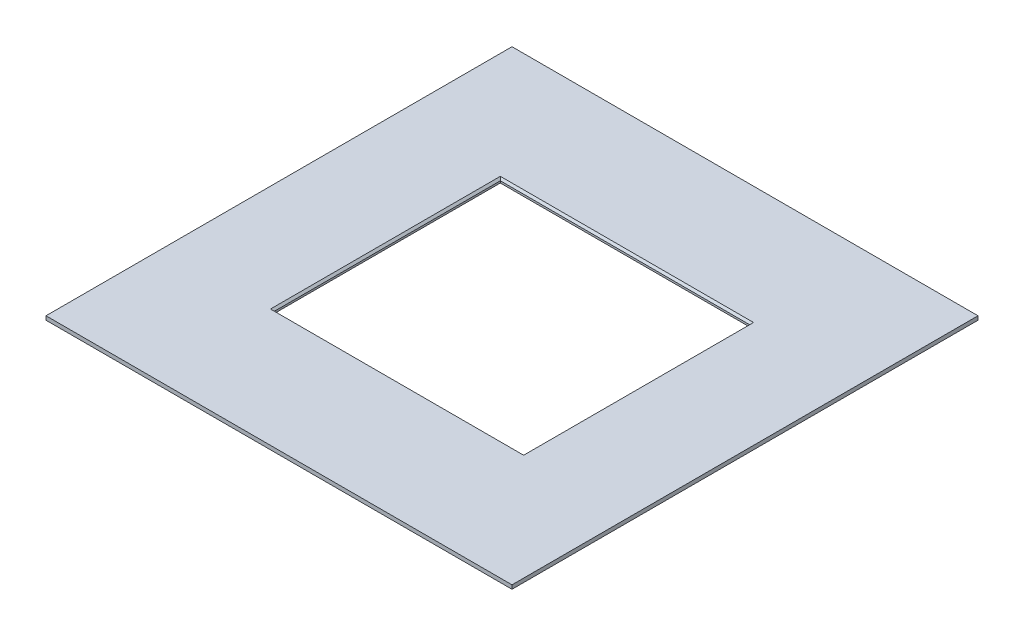
ISO-10303-21;
HEADER;
FILE_DESCRIPTION(('STEP AP214'),'2;1');
FILE_NAME('part.step','',(''),(''),'','','');
FILE_SCHEMA(('AUTOMOTIVE_DESIGN { 1 0 10303 214 1 1 1 1 }'));
ENDSEC;
DATA;
#1=APPLICATION_CONTEXT('core data for automotive mechanical design processes');
#2=APPLICATION_PROTOCOL_DEFINITION('international standard','automotive_design',2000,#1);
#3=PRODUCT_CONTEXT('',#1,'mechanical');
#4=PRODUCT('Part','Part','',(#3));
#5=PRODUCT_RELATED_PRODUCT_CATEGORY('part','',(#4));
#6=PRODUCT_DEFINITION_FORMATION('','',#4);
#7=PRODUCT_DEFINITION_CONTEXT('part definition',#1,'design');
#8=PRODUCT_DEFINITION('design','',#6,#7);
#9=PRODUCT_DEFINITION_SHAPE('','',#8);
#10=(LENGTH_UNIT() NAMED_UNIT(*) SI_UNIT(.MILLI.,.METRE.));
#11=(NAMED_UNIT(*) PLANE_ANGLE_UNIT() SI_UNIT($,.RADIAN.));
#12=(NAMED_UNIT(*) SI_UNIT($,.STERADIAN.) SOLID_ANGLE_UNIT());
#13=UNCERTAINTY_MEASURE_WITH_UNIT(LENGTH_MEASURE(1.E-05),#10,'distance_accuracy_value','');
#14=(GEOMETRIC_REPRESENTATION_CONTEXT(3) GLOBAL_UNCERTAINTY_ASSIGNED_CONTEXT((#13)) GLOBAL_UNIT_ASSIGNED_CONTEXT((#10,
#11,#12)) REPRESENTATION_CONTEXT('',''));
#15=CARTESIAN_POINT('',(0.,0.,0.));
#16=DIRECTION('',(0.,0.,1.));
#17=DIRECTION('',(1.,0.,0.));
#18=AXIS2_PLACEMENT_3D('',#15,#16,#17);
#19=CARTESIAN_POINT('',(0.,1.,0.));
#20=DIRECTION('',(0.,1.,0.));
#21=DIRECTION('',(0.,0.,1.));
#22=AXIS2_PLACEMENT_3D('',#19,#20,#21);
#23=PLANE('',#22);
#24=DIRECTION('',(0.,0.,1.));
#25=VECTOR('',#24,1.);
#26=CARTESIAN_POINT('',(32.6,1.,0.));
#27=LINE('',#26,#25);
#28=CARTESIAN_POINT('',(32.6,1.,-29.6));
#29=VERTEX_POINT('',#28);
#30=CARTESIAN_POINT('',(32.6,1.,29.6));
#31=VERTEX_POINT('',#30);
#32=EDGE_CURVE('E210',#29,#31,#27,.T.);
#33=ORIENTED_EDGE('',*,*,#32,.T.);
#34=DIRECTION('',(-1.,0.,0.));
#35=VECTOR('',#34,1.);
#36=CARTESIAN_POINT('',(0.,1.,29.6));
#37=LINE('',#36,#35);
#38=CARTESIAN_POINT('',(-32.6,1.,29.6));
#39=VERTEX_POINT('',#38);
#40=EDGE_CURVE('E213',#31,#39,#37,.T.);
#41=ORIENTED_EDGE('',*,*,#40,.T.);
#42=DIRECTION('',(0.,0.,-1.));
#43=VECTOR('',#42,1.);
#44=CARTESIAN_POINT('',(-32.6,1.,0.));
#45=LINE('',#44,#43);
#46=CARTESIAN_POINT('',(-32.6,1.,-29.6));
#47=VERTEX_POINT('',#46);
#48=EDGE_CURVE('E207',#39,#47,#45,.T.);
#49=ORIENTED_EDGE('',*,*,#48,.T.);
#50=DIRECTION('',(1.,0.,0.));
#51=VECTOR('',#50,1.);
#52=CARTESIAN_POINT('',(0.,1.,-29.6));
#53=LINE('',#52,#51);
#54=EDGE_CURVE('E204',#47,#29,#53,.T.);
#55=ORIENTED_EDGE('',*,*,#54,.T.);
#56=EDGE_LOOP('',(#33,#41,#49,#55));
#57=FACE_BOUND('',#56,.T.);
#58=DIRECTION('',(0.,0.,-1.));
#59=VECTOR('',#58,1.);
#60=CARTESIAN_POINT('',(60.,1.,-60.));
#61=LINE('',#60,#59);
#62=CARTESIAN_POINT('',(60.,1.,60.));
#63=VERTEX_POINT('',#62);
#64=CARTESIAN_POINT('',(60.,1.,-60.));
#65=VERTEX_POINT('',#64);
#66=EDGE_CURVE('E159',#63,#65,#61,.T.);
#67=ORIENTED_EDGE('',*,*,#66,.T.);
#68=DIRECTION('',(-1.,0.,0.));
#69=VECTOR('',#68,1.);
#70=CARTESIAN_POINT('',(-60.,1.,-60.));
#71=LINE('',#70,#69);
#72=CARTESIAN_POINT('',(-60.,1.,-60.));
#73=VERTEX_POINT('',#72);
#74=EDGE_CURVE('E163',#65,#73,#71,.T.);
#75=ORIENTED_EDGE('',*,*,#74,.T.);
#76=DIRECTION('',(0.,0.,1.));
#77=VECTOR('',#76,1.);
#78=CARTESIAN_POINT('',(-60.,1.,-60.));
#79=LINE('',#78,#77);
#80=CARTESIAN_POINT('',(-60.,1.,60.));
#81=VERTEX_POINT('',#80);
#82=EDGE_CURVE('E167',#73,#81,#79,.T.);
#83=ORIENTED_EDGE('',*,*,#82,.T.);
#84=DIRECTION('',(1.,0.,0.));
#85=VECTOR('',#84,1.);
#86=CARTESIAN_POINT('',(-60.,1.,60.));
#87=LINE('',#86,#85);
#88=EDGE_CURVE('E170',#81,#63,#87,.T.);
#89=ORIENTED_EDGE('',*,*,#88,.T.);
#90=EDGE_LOOP('',(#67,#75,#83,#89));
#91=FACE_BOUND('',#90,.T.);
#92=ADVANCED_FACE('F41',(#57,#91),#23,.T.);
#93=CARTESIAN_POINT('',(0.,0.,0.));
#94=DIRECTION('',(0.,1.,0.));
#95=DIRECTION('',(0.,0.,1.));
#96=AXIS2_PLACEMENT_3D('',#93,#94,#95);
#97=PLANE('',#96);
#98=DIRECTION('',(0.,0.,-1.));
#99=VECTOR('',#98,1.);
#100=CARTESIAN_POINT('',(60.,0.,-60.));
#101=LINE('',#100,#99);
#102=CARTESIAN_POINT('',(60.,0.,60.));
#103=VERTEX_POINT('',#102);
#104=CARTESIAN_POINT('',(60.,0.,-60.));
#105=VERTEX_POINT('',#104);
#106=EDGE_CURVE('E126',#103,#105,#101,.T.);
#107=ORIENTED_EDGE('',*,*,#106,.F.);
#108=DIRECTION('',(1.,0.,0.));
#109=VECTOR('',#108,1.);
#110=CARTESIAN_POINT('',(-60.,0.,60.));
#111=LINE('',#110,#109);
#112=CARTESIAN_POINT('',(-60.,0.,60.));
#113=VERTEX_POINT('',#112);
#114=EDGE_CURVE('E164',#113,#103,#111,.T.);
#115=ORIENTED_EDGE('',*,*,#114,.F.);
#116=DIRECTION('',(0.,0.,1.));
#117=VECTOR('',#116,1.);
#118=CARTESIAN_POINT('',(-60.,0.,-60.));
#119=LINE('',#118,#117);
#120=CARTESIAN_POINT('',(-60.,0.,-60.));
#121=VERTEX_POINT('',#120);
#122=EDGE_CURVE('E180',#121,#113,#119,.T.);
#123=ORIENTED_EDGE('',*,*,#122,.F.);
#124=DIRECTION('',(-1.,0.,0.));
#125=VECTOR('',#124,1.);
#126=CARTESIAN_POINT('',(-60.,0.,-60.));
#127=LINE('',#126,#125);
#128=EDGE_CURVE('E177',#105,#121,#127,.T.);
#129=ORIENTED_EDGE('',*,*,#128,.F.);
#130=EDGE_LOOP('',(#107,#115,#123,#129));
#131=FACE_BOUND('',#130,.T.);
#132=DIRECTION('',(0.,0.,-1.));
#133=VECTOR('',#132,1.);
#134=CARTESIAN_POINT('',(32.1,0.,-29.1));
#135=LINE('',#134,#133);
#136=CARTESIAN_POINT('',(32.1,0.,29.1));
#137=VERTEX_POINT('',#136);
#138=CARTESIAN_POINT('',(32.1,0.,-29.1));
#139=VERTEX_POINT('',#138);
#140=EDGE_CURVE('E123',#137,#139,#135,.T.);
#141=ORIENTED_EDGE('',*,*,#140,.T.);
#142=DIRECTION('',(-1.,0.,0.));
#143=VECTOR('',#142,1.);
#144=CARTESIAN_POINT('',(-32.1,0.,-29.1));
#145=LINE('',#144,#143);
#146=CARTESIAN_POINT('',(-32.1,0.,-29.1));
#147=VERTEX_POINT('',#146);
#148=EDGE_CURVE('E130',#139,#147,#145,.T.);
#149=ORIENTED_EDGE('',*,*,#148,.T.);
#150=DIRECTION('',(0.,0.,1.));
#151=VECTOR('',#150,1.);
#152=CARTESIAN_POINT('',(-32.1,0.,-29.1));
#153=LINE('',#152,#151);
#154=CARTESIAN_POINT('',(-32.1,0.,29.1));
#155=VERTEX_POINT('',#154);
#156=EDGE_CURVE('E136',#147,#155,#153,.T.);
#157=ORIENTED_EDGE('',*,*,#156,.T.);
#158=DIRECTION('',(1.,0.,0.));
#159=VECTOR('',#158,1.);
#160=CARTESIAN_POINT('',(-32.1,0.,29.1));
#161=LINE('',#160,#159);
#162=EDGE_CURVE('E140',#155,#137,#161,.T.);
#163=ORIENTED_EDGE('',*,*,#162,.T.);
#164=EDGE_LOOP('',(#141,#149,#157,#163));
#165=FACE_BOUND('',#164,.T.);
#166=ADVANCED_FACE('F138',(#131,#165),#97,.F.);
#167=CARTESIAN_POINT('',(60.,1.,-60.));
#168=DIRECTION('',(-1.,0.,0.));
#169=DIRECTION('',(0.,0.,1.));
#170=AXIS2_PLACEMENT_3D('',#167,#168,#169);
#171=PLANE('',#170);
#172=ORIENTED_EDGE('',*,*,#106,.T.);
#173=DIRECTION('',(0.,-1.,0.));
#174=VECTOR('',#173,1.);
#175=CARTESIAN_POINT('',(60.,1.,-60.));
#176=LINE('',#175,#174);
#177=EDGE_CURVE('E196',#65,#105,#176,.T.);
#178=ORIENTED_EDGE('',*,*,#177,.F.);
#179=ORIENTED_EDGE('',*,*,#66,.F.);
#180=DIRECTION('',(0.,-1.,0.));
#181=VECTOR('',#180,1.);
#182=CARTESIAN_POINT('',(60.,1.,60.));
#183=LINE('',#182,#181);
#184=EDGE_CURVE('E173',#63,#103,#183,.T.);
#185=ORIENTED_EDGE('',*,*,#184,.T.);
#186=EDGE_LOOP('',(#172,#178,#179,#185));
#187=FACE_BOUND('',#186,.T.);
#188=ADVANCED_FACE('F260',(#187),#171,.F.);
#189=CARTESIAN_POINT('',(-60.,1.,-60.));
#190=DIRECTION('',(0.,0.,1.));
#191=DIRECTION('',(1.,0.,0.));
#192=AXIS2_PLACEMENT_3D('',#189,#190,#191);
#193=PLANE('',#192);
#194=ORIENTED_EDGE('',*,*,#128,.T.);
#195=DIRECTION('',(0.,-1.,0.));
#196=VECTOR('',#195,1.);
#197=CARTESIAN_POINT('',(-60.,1.,-60.));
#198=LINE('',#197,#196);
#199=EDGE_CURVE('E192',#73,#121,#198,.T.);
#200=ORIENTED_EDGE('',*,*,#199,.F.);
#201=ORIENTED_EDGE('',*,*,#74,.F.);
#202=ORIENTED_EDGE('',*,*,#177,.T.);
#203=EDGE_LOOP('',(#194,#200,#201,#202));
#204=FACE_BOUND('',#203,.T.);
#205=ADVANCED_FACE('F263',(#204),#193,.F.);
#206=CARTESIAN_POINT('',(-60.,1.,-60.));
#207=DIRECTION('',(1.,0.,0.));
#208=DIRECTION('',(0.,0.,-1.));
#209=AXIS2_PLACEMENT_3D('',#206,#207,#208);
#210=PLANE('',#209);
#211=ORIENTED_EDGE('',*,*,#122,.T.);
#212=DIRECTION('',(0.,-1.,0.));
#213=VECTOR('',#212,1.);
#214=CARTESIAN_POINT('',(-60.,1.,60.));
#215=LINE('',#214,#213);
#216=EDGE_CURVE('E188',#81,#113,#215,.T.);
#217=ORIENTED_EDGE('',*,*,#216,.F.);
#218=ORIENTED_EDGE('',*,*,#82,.F.);
#219=ORIENTED_EDGE('',*,*,#199,.T.);
#220=EDGE_LOOP('',(#211,#217,#218,#219));
#221=FACE_BOUND('',#220,.T.);
#222=ADVANCED_FACE('F268',(#221),#210,.F.);
#223=CARTESIAN_POINT('',(-60.,1.,60.));
#224=DIRECTION('',(0.,0.,-1.));
#225=DIRECTION('',(-1.,0.,0.));
#226=AXIS2_PLACEMENT_3D('',#223,#224,#225);
#227=PLANE('',#226);
#228=ORIENTED_EDGE('',*,*,#114,.T.);
#229=ORIENTED_EDGE('',*,*,#184,.F.);
#230=ORIENTED_EDGE('',*,*,#88,.F.);
#231=ORIENTED_EDGE('',*,*,#216,.T.);
#232=EDGE_LOOP('',(#228,#229,#230,#231));
#233=FACE_BOUND('',#232,.T.);
#234=ADVANCED_FACE('F271',(#233),#227,.F.);
#235=CARTESIAN_POINT('',(32.1,1.,-29.1));
#236=DIRECTION('',(-1.,0.,0.));
#237=DIRECTION('',(0.,0.,1.));
#238=AXIS2_PLACEMENT_3D('',#235,#236,#237);
#239=PLANE('',#238);
#240=DIRECTION('',(0.,-1.,0.));
#241=VECTOR('',#240,1.);
#242=CARTESIAN_POINT('',(32.1,1.,29.1));
#243=LINE('',#242,#241);
#244=CARTESIAN_POINT('',(32.1,0.5,29.1));
#245=VERTEX_POINT('',#244);
#246=EDGE_CURVE('E151',#245,#137,#243,.T.);
#247=ORIENTED_EDGE('',*,*,#246,.F.);
#248=DIRECTION('',(0.,0.,-1.));
#249=VECTOR('',#248,1.);
#250=CARTESIAN_POINT('',(32.1,0.5,-29.1));
#251=LINE('',#250,#249);
#252=CARTESIAN_POINT('',(32.1,0.5,-29.1));
#253=VERTEX_POINT('',#252);
#254=EDGE_CURVE('E66',#245,#253,#251,.T.);
#255=ORIENTED_EDGE('',*,*,#254,.T.);
#256=DIRECTION('',(0.,-1.,0.));
#257=VECTOR('',#256,1.);
#258=CARTESIAN_POINT('',(32.1,1.,-29.1));
#259=LINE('',#258,#257);
#260=EDGE_CURVE('E119',#253,#139,#259,.T.);
#261=ORIENTED_EDGE('',*,*,#260,.T.);
#262=ORIENTED_EDGE('',*,*,#140,.F.);
#263=EDGE_LOOP('',(#247,#255,#261,#262));
#264=FACE_BOUND('',#263,.T.);
#265=ADVANCED_FACE('F121',(#264),#239,.T.);
#266=CARTESIAN_POINT('',(-32.1,1.,-29.1));
#267=DIRECTION('',(0.,0.,1.));
#268=DIRECTION('',(1.,0.,0.));
#269=AXIS2_PLACEMENT_3D('',#266,#267,#268);
#270=PLANE('',#269);
#271=ORIENTED_EDGE('',*,*,#260,.F.);
#272=DIRECTION('',(-1.,0.,0.));
#273=VECTOR('',#272,1.);
#274=CARTESIAN_POINT('',(-32.1,0.5,-29.1));
#275=LINE('',#274,#273);
#276=CARTESIAN_POINT('',(-32.1,0.5,-29.1));
#277=VERTEX_POINT('',#276);
#278=EDGE_CURVE('E11',#253,#277,#275,.T.);
#279=ORIENTED_EDGE('',*,*,#278,.T.);
#280=DIRECTION('',(0.,-1.,0.));
#281=VECTOR('',#280,1.);
#282=CARTESIAN_POINT('',(-32.1,1.,-29.1));
#283=LINE('',#282,#281);
#284=EDGE_CURVE('E127',#277,#147,#283,.T.);
#285=ORIENTED_EDGE('',*,*,#284,.T.);
#286=ORIENTED_EDGE('',*,*,#148,.F.);
#287=EDGE_LOOP('',(#271,#279,#285,#286));
#288=FACE_BOUND('',#287,.T.);
#289=ADVANCED_FACE('F131',(#288),#270,.T.);
#290=CARTESIAN_POINT('',(-32.1,1.,-29.1));
#291=DIRECTION('',(1.,0.,0.));
#292=DIRECTION('',(0.,0.,-1.));
#293=AXIS2_PLACEMENT_3D('',#290,#291,#292);
#294=PLANE('',#293);
#295=ORIENTED_EDGE('',*,*,#284,.F.);
#296=DIRECTION('',(0.,0.,1.));
#297=VECTOR('',#296,1.);
#298=CARTESIAN_POINT('',(-32.1,0.5,-29.1));
#299=LINE('',#298,#297);
#300=CARTESIAN_POINT('',(-32.1,0.5,29.1));
#301=VERTEX_POINT('',#300);
#302=EDGE_CURVE('E52',#277,#301,#299,.T.);
#303=ORIENTED_EDGE('',*,*,#302,.T.);
#304=DIRECTION('',(0.,-1.,0.));
#305=VECTOR('',#304,1.);
#306=CARTESIAN_POINT('',(-32.1,1.,29.1));
#307=LINE('',#306,#305);
#308=EDGE_CURVE('E154',#301,#155,#307,.T.);
#309=ORIENTED_EDGE('',*,*,#308,.T.);
#310=ORIENTED_EDGE('',*,*,#156,.F.);
#311=EDGE_LOOP('',(#295,#303,#309,#310));
#312=FACE_BOUND('',#311,.T.);
#313=ADVANCED_FACE('F244',(#312),#294,.T.);
#314=CARTESIAN_POINT('',(-32.1,1.,29.1));
#315=DIRECTION('',(0.,0.,-1.));
#316=DIRECTION('',(-1.,0.,0.));
#317=AXIS2_PLACEMENT_3D('',#314,#315,#316);
#318=PLANE('',#317);
#319=ORIENTED_EDGE('',*,*,#308,.F.);
#320=DIRECTION('',(1.,0.,0.));
#321=VECTOR('',#320,1.);
#322=CARTESIAN_POINT('',(-32.1,0.5,29.1));
#323=LINE('',#322,#321);
#324=EDGE_CURVE('E200',#301,#245,#323,.T.);
#325=ORIENTED_EDGE('',*,*,#324,.T.);
#326=ORIENTED_EDGE('',*,*,#246,.T.);
#327=ORIENTED_EDGE('',*,*,#162,.F.);
#328=EDGE_LOOP('',(#319,#325,#326,#327));
#329=FACE_BOUND('',#328,.T.);
#330=ADVANCED_FACE('F246',(#329),#318,.T.);
#331=CARTESIAN_POINT('',(-32.1,0.5,-29.1));
#332=DIRECTION('',(0.,-0.707106781186547,-0.707106781186547));
#333=DIRECTION('',(-1.,0.,0.));
#334=AXIS2_PLACEMENT_3D('',#331,#332,#333);
#335=PLANE('',#334);
#336=DIRECTION('',(0.577350269189626,0.577350269189626,-0.577350269189626));
#337=VECTOR('',#336,1.);
#338=CARTESIAN_POINT('',(32.1,0.5,-29.1));
#339=LINE('',#338,#337);
#340=EDGE_CURVE('E145',#29,#253,#339,.F.);
#341=ORIENTED_EDGE('',*,*,#340,.F.);
#342=ORIENTED_EDGE('',*,*,#54,.F.);
#343=DIRECTION('',(0.577350269189623,-0.577350269189627,0.577350269189627));
#344=VECTOR('',#343,1.);
#345=CARTESIAN_POINT('',(-32.1,0.5,-29.1));
#346=LINE('',#345,#344);
#347=EDGE_CURVE('E46',#277,#47,#346,.F.);
#348=ORIENTED_EDGE('',*,*,#347,.F.);
#349=ORIENTED_EDGE('',*,*,#278,.F.);
#350=EDGE_LOOP('',(#341,#342,#348,#349));
#351=FACE_BOUND('',#350,.T.);
#352=ADVANCED_FACE('F44',(#351),#335,.F.);
#353=CARTESIAN_POINT('',(-32.1,0.5,-29.1));
#354=DIRECTION('',(-0.70710678118655,-0.707106781186545,0.));
#355=DIRECTION('',(0.,0.,1.));
#356=AXIS2_PLACEMENT_3D('',#353,#354,#355);
#357=PLANE('',#356);
#358=ORIENTED_EDGE('',*,*,#347,.T.);
#359=ORIENTED_EDGE('',*,*,#48,.F.);
#360=DIRECTION('',(0.577350269189623,-0.577350269189627,-0.577350269189627));
#361=VECTOR('',#360,1.);
#362=CARTESIAN_POINT('',(-32.1,0.5,29.1));
#363=LINE('',#362,#361);
#364=EDGE_CURVE('E224',#301,#39,#363,.F.);
#365=ORIENTED_EDGE('',*,*,#364,.F.);
#366=ORIENTED_EDGE('',*,*,#302,.F.);
#367=EDGE_LOOP('',(#358,#359,#365,#366));
#368=FACE_BOUND('',#367,.T.);
#369=ADVANCED_FACE('F240',(#368),#357,.F.);
#370=CARTESIAN_POINT('',(32.1,0.5,-29.1));
#371=DIRECTION('',(0.707106781186547,-0.707106781186547,0.));
#372=DIRECTION('',(0.,0.,-1.));
#373=AXIS2_PLACEMENT_3D('',#370,#371,#372);
#374=PLANE('',#373);
#375=ORIENTED_EDGE('',*,*,#340,.T.);
#376=ORIENTED_EDGE('',*,*,#254,.F.);
#377=DIRECTION('',(0.577350269189626,0.577350269189626,0.577350269189626));
#378=VECTOR('',#377,1.);
#379=CARTESIAN_POINT('',(10.7,-20.9,7.69999999999999));
#380=LINE('',#379,#378);
#381=EDGE_CURVE('E221',#31,#245,#380,.F.);
#382=ORIENTED_EDGE('',*,*,#381,.F.);
#383=ORIENTED_EDGE('',*,*,#32,.F.);
#384=EDGE_LOOP('',(#375,#376,#382,#383));
#385=FACE_BOUND('',#384,.T.);
#386=ADVANCED_FACE('F231',(#385),#374,.F.);
#387=CARTESIAN_POINT('',(-32.1,0.5,29.1));
#388=DIRECTION('',(0.,-0.707106781186547,0.707106781186547));
#389=DIRECTION('',(1.,0.,0.));
#390=AXIS2_PLACEMENT_3D('',#387,#388,#389);
#391=PLANE('',#390);
#392=ORIENTED_EDGE('',*,*,#364,.T.);
#393=ORIENTED_EDGE('',*,*,#40,.F.);
#394=ORIENTED_EDGE('',*,*,#381,.T.);
#395=ORIENTED_EDGE('',*,*,#324,.F.);
#396=EDGE_LOOP('',(#392,#393,#394,#395));
#397=FACE_BOUND('',#396,.T.);
#398=ADVANCED_FACE('F248',(#397),#391,.F.);
#399=CLOSED_SHELL('',(#92,#166,#188,#205,#222,#234,#265,#289,#313,#330,#352,#369,#386,#398));
#400=MANIFOLD_SOLID_BREP('B2',#399);
#401=ADVANCED_BREP_SHAPE_REPRESENTATION('',(#18,#400),#14);
#402=SHAPE_DEFINITION_REPRESENTATION(#9,#401);
ENDSEC;
END-ISO-10303-21;
